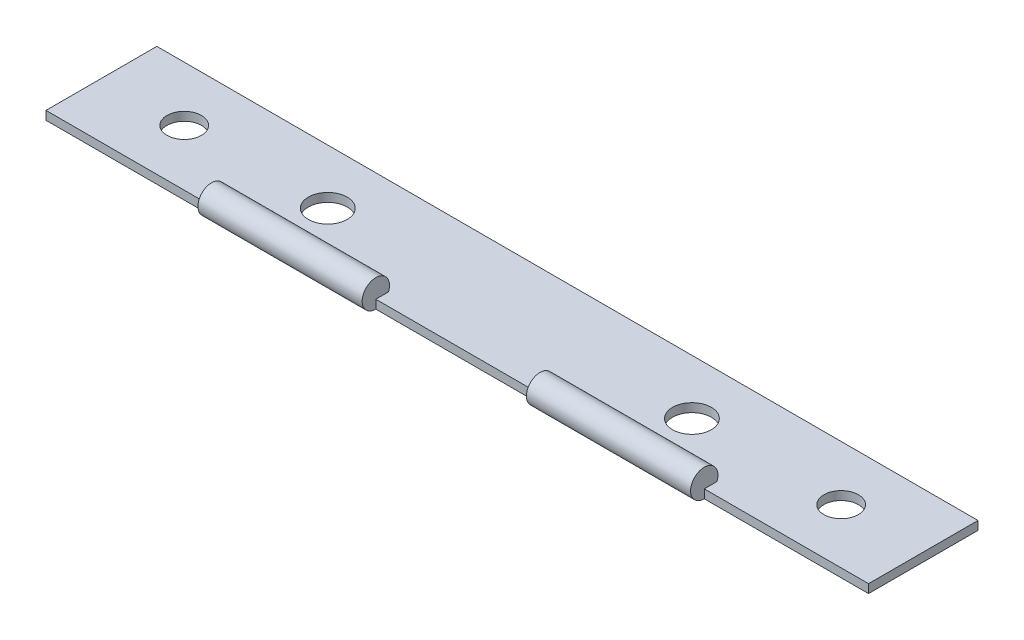
ISO-10303-21;
HEADER;
FILE_DESCRIPTION(('STEP AP214'),'2;1');
FILE_NAME('part.step','',(''),(''),'','','');
FILE_SCHEMA(('AUTOMOTIVE_DESIGN { 1 0 10303 214 1 1 1 1 }'));
ENDSEC;
DATA;
#1=APPLICATION_CONTEXT('core data for automotive mechanical design processes');
#2=APPLICATION_PROTOCOL_DEFINITION('international standard','automotive_design',2000,#1);
#3=PRODUCT_CONTEXT('',#1,'mechanical');
#4=PRODUCT('Part','Part','',(#3));
#5=PRODUCT_RELATED_PRODUCT_CATEGORY('part','',(#4));
#6=PRODUCT_DEFINITION_FORMATION('','',#4);
#7=PRODUCT_DEFINITION_CONTEXT('part definition',#1,'design');
#8=PRODUCT_DEFINITION('design','',#6,#7);
#9=PRODUCT_DEFINITION_SHAPE('','',#8);
#10=(LENGTH_UNIT() NAMED_UNIT(*) SI_UNIT(.MILLI.,.METRE.));
#11=(NAMED_UNIT(*) PLANE_ANGLE_UNIT() SI_UNIT($,.RADIAN.));
#12=(NAMED_UNIT(*) SI_UNIT($,.STERADIAN.) SOLID_ANGLE_UNIT());
#13=UNCERTAINTY_MEASURE_WITH_UNIT(LENGTH_MEASURE(1.E-05),#10,'distance_accuracy_value','');
#14=(GEOMETRIC_REPRESENTATION_CONTEXT(3) GLOBAL_UNCERTAINTY_ASSIGNED_CONTEXT((#13)) GLOBAL_UNIT_ASSIGNED_CONTEXT((#10,
#11,#12)) REPRESENTATION_CONTEXT('',''));
#15=CARTESIAN_POINT('',(0.,0.,0.));
#16=DIRECTION('',(0.,0.,1.));
#17=DIRECTION('',(1.,0.,0.));
#18=AXIS2_PLACEMENT_3D('',#15,#16,#17);
#19=CARTESIAN_POINT('',(0.,1.,0.));
#20=DIRECTION('',(1.,0.,0.));
#21=DIRECTION('',(0.,0.,-1.));
#22=AXIS2_PLACEMENT_3D('',#19,#20,#21);
#23=PLANE('',#22);
#24=DIRECTION('',(0.,0.,-1.));
#25=VECTOR('',#24,1.);
#26=CARTESIAN_POINT('',(0.,1.,-12.7));
#27=LINE('',#26,#25);
#28=CARTESIAN_POINT('',(0.,1.,0.158652849805208));
#29=VERTEX_POINT('',#28);
#30=CARTESIAN_POINT('',(0.,1.,-1.47478812037526));
#31=VERTEX_POINT('',#30);
#32=EDGE_CURVE('E141',#29,#31,#27,.T.);
#33=ORIENTED_EDGE('',*,*,#32,.F.);
#34=DIRECTION('',(0.,1.,0.));
#35=VECTOR('',#34,1.);
#36=CARTESIAN_POINT('',(0.,0.,0.158652849805208));
#37=LINE('',#36,#35);
#38=CARTESIAN_POINT('',(0.,0.00412711096169409,0.158450945450297));
#39=VERTEX_POINT('',#38);
#40=EDGE_CURVE('E50',#39,#29,#37,.T.);
#41=ORIENTED_EDGE('',*,*,#40,.F.);
#42=CARTESIAN_POINT('',(0.,0.,0.));
#43=CARTESIAN_POINT('',(0.,0.,0.522526401125121));
#44=CARTESIAN_POINT('',(0.,0.310801617957189,0.94350277757369));
#45=CARTESIAN_POINT('',(0.,0.62095901229367,1.36360656227949));
#46=CARTESIAN_POINT('',(0.,1.12150865044318,1.51756657585037));
#47=CARTESIAN_POINT('',(0.,1.62062457565087,1.67108560525673));
#48=CARTESIAN_POINT('',(0.,2.11467976531822,1.49741034624415));
#49=CARTESIAN_POINT('',(0.,2.60731984394509,1.32423254132502));
#50=CARTESIAN_POINT('',(0.,2.90142779481979,0.890926484060273));
#51=CARTESIAN_POINT('',(0.,3.1946933389816,0.458861535477884));
#52=CARTESIAN_POINT('',(0.,3.17369282021564,-0.0644095264408868));
#53=CARTESIAN_POINT('',(0.,3.15275245275785,-0.586181794961014));
#54=CARTESIAN_POINT('',(0.,2.82486645044287,-0.99452527233772));
#55=CARTESIAN_POINT('',(0.,2.49791960454525,-1.40169914078157));
#56=CARTESIAN_POINT('',(0.,1.99153552028762,-1.53522361509518));
#57=CARTESIAN_POINT('',(0.,1.48619958769518,-1.66847171046157));
#58=CARTESIAN_POINT('',(0.,1.,-1.47478812037526));
#59=B_SPLINE_CURVE_WITH_KNOTS('',2,(#42,#43,#44,#45,#46,#47,#48,#49,#50,#51,#52,#53,#54,#55,#56,
#57,#58),.UNSPECIFIED.,.F.,.F.,(3,2,2,2,2,2,2,2,3),(0.,0.125,0.25,0.375,0.5,0.625,0.75,0.875,
1.),.UNSPECIFIED.);
#60=EDGE_CURVE('E184',#39,#31,#59,.T.);
#61=ORIENTED_EDGE('',*,*,#60,.T.);
#62=EDGE_LOOP('',(#33,#41,#61));
#63=FACE_BOUND('',#62,.T.);
#64=ADVANCED_FACE('F33',(#63),#23,.F.);
#65=CARTESIAN_POINT('',(0.,1.,0.));
#66=DIRECTION('',(0.,0.,-1.));
#67=DIRECTION('',(-1.,0.,0.));
#68=AXIS2_PLACEMENT_3D('',#65,#66,#67);
#69=PLANE('',#68);
#70=DIRECTION('',(0.,1.,0.));
#71=VECTOR('',#70,1.);
#72=CARTESIAN_POINT('',(57.15,1.,0.));
#73=LINE('',#72,#71);
#74=CARTESIAN_POINT('',(57.15,0.,0.));
#75=VERTEX_POINT('',#74);
#76=CARTESIAN_POINT('',(57.15,1.,0.));
#77=VERTEX_POINT('',#76);
#78=EDGE_CURVE('E171',#75,#77,#73,.T.);
#79=ORIENTED_EDGE('',*,*,#78,.F.);
#80=DIRECTION('',(1.,0.,0.));
#81=VECTOR('',#80,1.);
#82=CARTESIAN_POINT('',(0.,0.,0.));
#83=LINE('',#82,#81);
#84=CARTESIAN_POINT('',(76.2,0.,0.));
#85=VERTEX_POINT('',#84);
#86=EDGE_CURVE('E198',#75,#85,#83,.T.);
#87=ORIENTED_EDGE('',*,*,#86,.T.);
#88=DIRECTION('',(0.,-1.,0.));
#89=VECTOR('',#88,1.);
#90=CARTESIAN_POINT('',(76.2,1.,0.));
#91=LINE('',#90,#89);
#92=CARTESIAN_POINT('',(76.2,1.,0.));
#93=VERTEX_POINT('',#92);
#94=EDGE_CURVE('E181',#93,#85,#91,.T.);
#95=ORIENTED_EDGE('',*,*,#94,.F.);
#96=DIRECTION('',(1.,0.,0.));
#97=VECTOR('',#96,1.);
#98=CARTESIAN_POINT('',(0.,1.,0.));
#99=LINE('',#98,#97);
#100=EDGE_CURVE('E124',#77,#93,#99,.T.);
#101=ORIENTED_EDGE('',*,*,#100,.F.);
#102=EDGE_LOOP('',(#79,#87,#95,#101));
#103=FACE_BOUND('',#102,.T.);
#104=ADVANCED_FACE('F245',(#103),#69,.F.);
#105=CARTESIAN_POINT('',(0.,1.,0.));
#106=DIRECTION('',(0.,-1.,0.));
#107=DIRECTION('',(0.,0.,-1.));
#108=AXIS2_PLACEMENT_3D('',#105,#106,#107);
#109=PLANE('',#108);
#110=CARTESIAN_POINT('',(7.12683113823961,1.,-6.34999999999997));
#111=DIRECTION('',(0.,1.,0.));
#112=DIRECTION('',(0.,0.,1.));
#113=AXIS2_PLACEMENT_3D('',#110,#111,#112);
#114=CIRCLE('',#113,2.24999999999999);
#115=CARTESIAN_POINT('',(7.12683113823961,1.,-4.09999999999998));
#116=VERTEX_POINT('',#115);
#117=EDGE_CURVE('E420',#116,#116,#114,.T.);
#118=ORIENTED_EDGE('',*,*,#117,.F.);
#119=EDGE_LOOP('',(#118));
#120=FACE_BOUND('',#119,.T.);
#121=CARTESIAN_POINT('',(49.3672841895202,1.,-6.34999999999997));
#122=DIRECTION('',(0.,1.,0.));
#123=DIRECTION('',(0.,0.,1.));
#124=AXIS2_PLACEMENT_3D('',#121,#122,#123);
#125=CIRCLE('',#124,2.24999999999999);
#126=CARTESIAN_POINT('',(49.3672841895202,1.,-4.09999999999998));
#127=VERTEX_POINT('',#126);
#128=EDGE_CURVE('E422',#127,#127,#125,.T.);
#129=ORIENTED_EDGE('',*,*,#128,.F.);
#130=EDGE_LOOP('',(#129));
#131=FACE_BOUND('',#130,.T.);
#132=CARTESIAN_POINT('',(-9.525,1.,-6.35));
#133=DIRECTION('',(0.,-1.,0.));
#134=DIRECTION('',(0.,0.,1.));
#135=AXIS2_PLACEMENT_3D('',#132,#133,#134);
#136=CIRCLE('',#135,2.);
#137=CARTESIAN_POINT('',(-9.525,1.,-4.35000000000001));
#138=VERTEX_POINT('',#137);
#139=EDGE_CURVE('E426',#138,#138,#136,.T.);
#140=ORIENTED_EDGE('',*,*,#139,.T.);
#141=EDGE_LOOP('',(#140));
#142=FACE_BOUND('',#141,.T.);
#143=CARTESIAN_POINT('',(66.675,1.,-6.35));
#144=DIRECTION('',(0.,1.,0.));
#145=DIRECTION('',(0.,0.,1.));
#146=AXIS2_PLACEMENT_3D('',#143,#144,#145);
#147=CIRCLE('',#146,2.);
#148=CARTESIAN_POINT('',(66.675,1.,-4.35000000000001));
#149=VERTEX_POINT('',#148);
#150=EDGE_CURVE('E146',#149,#149,#147,.T.);
#151=ORIENTED_EDGE('',*,*,#150,.F.);
#152=EDGE_LOOP('',(#151));
#153=FACE_BOUND('',#152,.T.);
#154=DIRECTION('',(0.,0.,-1.));
#155=VECTOR('',#154,1.);
#156=CARTESIAN_POINT('',(57.15,1.,0.));
#157=LINE('',#156,#155);
#158=CARTESIAN_POINT('',(57.15,1.,-1.47478812037526));
#159=VERTEX_POINT('',#158);
#160=EDGE_CURVE('E169',#77,#159,#157,.T.);
#161=ORIENTED_EDGE('',*,*,#160,.F.);
#162=ORIENTED_EDGE('',*,*,#100,.T.);
#163=DIRECTION('',(0.,0.,-1.));
#164=VECTOR('',#163,1.);
#165=CARTESIAN_POINT('',(76.2,1.,0.));
#166=LINE('',#165,#164);
#167=CARTESIAN_POINT('',(76.2,1.,-12.7));
#168=VERTEX_POINT('',#167);
#169=EDGE_CURVE('E176',#93,#168,#166,.T.);
#170=ORIENTED_EDGE('',*,*,#169,.T.);
#171=DIRECTION('',(-1.,0.,0.));
#172=VECTOR('',#171,1.);
#173=CARTESIAN_POINT('',(0.,1.,-12.7));
#174=LINE('',#173,#172);
#175=CARTESIAN_POINT('',(-19.05,1.,-12.7));
#176=VERTEX_POINT('',#175);
#177=EDGE_CURVE('E11',#168,#176,#174,.T.);
#178=ORIENTED_EDGE('',*,*,#177,.T.);
#179=DIRECTION('',(0.,0.,-1.));
#180=VECTOR('',#179,1.);
#181=CARTESIAN_POINT('',(-19.05,1.,-12.7));
#182=LINE('',#181,#180);
#183=CARTESIAN_POINT('',(-19.05,1.,0.158652849805208));
#184=VERTEX_POINT('',#183);
#185=EDGE_CURVE('E140',#184,#176,#182,.T.);
#186=ORIENTED_EDGE('',*,*,#185,.F.);
#187=DIRECTION('',(1.,0.,0.));
#188=VECTOR('',#187,1.);
#189=CARTESIAN_POINT('',(-19.05,1.,0.158652849805208));
#190=LINE('',#189,#188);
#191=EDGE_CURVE('E151',#184,#29,#190,.T.);
#192=ORIENTED_EDGE('',*,*,#191,.T.);
#193=ORIENTED_EDGE('',*,*,#32,.T.);
#194=DIRECTION('',(-1.,0.,0.));
#195=VECTOR('',#194,1.);
#196=CARTESIAN_POINT('',(19.05,1.,-1.47478812037526));
#197=LINE('',#196,#195);
#198=CARTESIAN_POINT('',(19.05,1.,-1.47478812037526));
#199=VERTEX_POINT('',#198);
#200=EDGE_CURVE('E195',#31,#199,#197,.F.);
#201=ORIENTED_EDGE('',*,*,#200,.T.);
#202=DIRECTION('',(0.,0.,-1.));
#203=VECTOR('',#202,1.);
#204=CARTESIAN_POINT('',(19.05,1.,0.));
#205=LINE('',#204,#203);
#206=CARTESIAN_POINT('',(19.05,1.,0.));
#207=VERTEX_POINT('',#206);
#208=EDGE_CURVE('E188',#207,#199,#205,.T.);
#209=ORIENTED_EDGE('',*,*,#208,.F.);
#210=CARTESIAN_POINT('',(38.1,1.,0.));
#211=VERTEX_POINT('',#210);
#212=EDGE_CURVE('E42',#207,#211,#99,.T.);
#213=ORIENTED_EDGE('',*,*,#212,.T.);
#214=DIRECTION('',(0.,0.,-1.));
#215=VECTOR('',#214,1.);
#216=CARTESIAN_POINT('',(38.1,1.,0.));
#217=LINE('',#216,#215);
#218=CARTESIAN_POINT('',(38.1,1.,-1.47478812037526));
#219=VERTEX_POINT('',#218);
#220=EDGE_CURVE('E162',#211,#219,#217,.T.);
#221=ORIENTED_EDGE('',*,*,#220,.T.);
#222=DIRECTION('',(-1.,0.,0.));
#223=VECTOR('',#222,1.);
#224=CARTESIAN_POINT('',(57.15,1.,-1.47478812037526));
#225=LINE('',#224,#223);
#226=EDGE_CURVE('E58',#219,#159,#225,.F.);
#227=ORIENTED_EDGE('',*,*,#226,.T.);
#228=EDGE_LOOP('',(#161,#162,#170,#178,#186,#192,#193,#201,#209,#213,#221,#227));
#229=FACE_BOUND('',#228,.T.);
#230=ADVANCED_FACE('F240',(#120,#131,#142,#153,#229),#109,.F.);
#231=CARTESIAN_POINT('',(19.05,0.,0.));
#232=VERTEX_POINT('',#231);
#233=CARTESIAN_POINT('',(38.1,0.,0.));
#234=VERTEX_POINT('',#233);
#235=EDGE_CURVE('E202',#232,#234,#83,.T.);
#236=ORIENTED_EDGE('',*,*,#235,.T.);
#237=DIRECTION('',(0.,1.,0.));
#238=VECTOR('',#237,1.);
#239=CARTESIAN_POINT('',(38.1,1.,0.));
#240=LINE('',#239,#238);
#241=EDGE_CURVE('E167',#234,#211,#240,.T.);
#242=ORIENTED_EDGE('',*,*,#241,.T.);
#243=ORIENTED_EDGE('',*,*,#212,.F.);
#244=DIRECTION('',(0.,1.,0.));
#245=VECTOR('',#244,1.);
#246=CARTESIAN_POINT('',(19.05,1.,0.));
#247=LINE('',#246,#245);
#248=EDGE_CURVE('E192',#232,#207,#247,.T.);
#249=ORIENTED_EDGE('',*,*,#248,.F.);
#250=EDGE_LOOP('',(#236,#242,#243,#249));
#251=FACE_BOUND('',#250,.T.);
#252=ADVANCED_FACE('F242',(#251),#69,.F.);
#253=CARTESIAN_POINT('',(0.,1.,-12.7));
#254=DIRECTION('',(0.,0.,1.));
#255=DIRECTION('',(1.,0.,0.));
#256=AXIS2_PLACEMENT_3D('',#253,#254,#255);
#257=PLANE('',#256);
#258=DIRECTION('',(-1.,0.,0.));
#259=VECTOR('',#258,1.);
#260=CARTESIAN_POINT('',(0.,0.,-12.7));
#261=LINE('',#260,#259);
#262=CARTESIAN_POINT('',(76.2,0.,-12.7));
#263=VERTEX_POINT('',#262);
#264=CARTESIAN_POINT('',(-19.05,0.,-12.7));
#265=VERTEX_POINT('',#264);
#266=EDGE_CURVE('E114',#263,#265,#261,.T.);
#267=ORIENTED_EDGE('',*,*,#266,.T.);
#268=DIRECTION('',(0.,-1.,0.));
#269=VECTOR('',#268,1.);
#270=CARTESIAN_POINT('',(-19.05,0.,-12.7));
#271=LINE('',#270,#269);
#272=EDGE_CURVE('E118',#176,#265,#271,.T.);
#273=ORIENTED_EDGE('',*,*,#272,.F.);
#274=ORIENTED_EDGE('',*,*,#177,.F.);
#275=DIRECTION('',(0.,-1.,0.));
#276=VECTOR('',#275,1.);
#277=CARTESIAN_POINT('',(76.2,1.,-12.7));
#278=LINE('',#277,#276);
#279=EDGE_CURVE('E120',#168,#263,#278,.T.);
#280=ORIENTED_EDGE('',*,*,#279,.T.);
#281=EDGE_LOOP('',(#267,#273,#274,#280));
#282=FACE_BOUND('',#281,.T.);
#283=ADVANCED_FACE('F116',(#282),#257,.F.);
#284=CARTESIAN_POINT('',(0.,0.,0.));
#285=DIRECTION('',(0.,-1.,0.));
#286=DIRECTION('',(0.,0.,-1.));
#287=AXIS2_PLACEMENT_3D('',#284,#285,#286);
#288=PLANE('',#287);
#289=CARTESIAN_POINT('',(7.12683113823961,0.,-6.34999999999997));
#290=DIRECTION('',(0.,-1.,0.));
#291=DIRECTION('',(0.,0.,-1.));
#292=AXIS2_PLACEMENT_3D('',#289,#290,#291);
#293=CIRCLE('',#292,2.24999999999999);
#294=CARTESIAN_POINT('',(7.12683113823961,0.,-8.59999999999996));
#295=VERTEX_POINT('',#294);
#296=EDGE_CURVE('E417',#295,#295,#293,.T.);
#297=ORIENTED_EDGE('',*,*,#296,.F.);
#298=EDGE_LOOP('',(#297));
#299=FACE_BOUND('',#298,.T.);
#300=CARTESIAN_POINT('',(49.3672841895202,0.,-6.34999999999997));
#301=DIRECTION('',(0.,-1.,0.));
#302=DIRECTION('',(0.,0.,-1.));
#303=AXIS2_PLACEMENT_3D('',#300,#301,#302);
#304=CIRCLE('',#303,2.24999999999999);
#305=CARTESIAN_POINT('',(49.3672841895202,0.,-8.59999999999996));
#306=VERTEX_POINT('',#305);
#307=EDGE_CURVE('E37',#306,#306,#304,.T.);
#308=ORIENTED_EDGE('',*,*,#307,.F.);
#309=EDGE_LOOP('',(#308));
#310=FACE_BOUND('',#309,.T.);
#311=CARTESIAN_POINT('',(-9.525,0.,-6.35));
#312=DIRECTION('',(0.,-1.,0.));
#313=DIRECTION('',(0.,0.,-1.));
#314=AXIS2_PLACEMENT_3D('',#311,#312,#313);
#315=CIRCLE('',#314,2.);
#316=CARTESIAN_POINT('',(-9.525,0.,-4.35000000000001));
#317=VERTEX_POINT('',#316);
#318=EDGE_CURVE('E428',#317,#317,#315,.F.);
#319=ORIENTED_EDGE('',*,*,#318,.T.);
#320=EDGE_LOOP('',(#319));
#321=FACE_BOUND('',#320,.T.);
#322=CARTESIAN_POINT('',(66.675,0.,-6.35));
#323=DIRECTION('',(0.,-1.,0.));
#324=DIRECTION('',(0.,0.,-1.));
#325=AXIS2_PLACEMENT_3D('',#322,#323,#324);
#326=CIRCLE('',#325,2.);
#327=CARTESIAN_POINT('',(66.675,0.,-4.35000000000001));
#328=VERTEX_POINT('',#327);
#329=EDGE_CURVE('E228',#328,#328,#326,.T.);
#330=ORIENTED_EDGE('',*,*,#329,.F.);
#331=EDGE_LOOP('',(#330));
#332=FACE_BOUND('',#331,.T.);
#333=CARTESIAN_POINT('',(0.,0.,0.));
#334=VERTEX_POINT('',#333);
#335=EDGE_CURVE('E125',#334,#232,#83,.T.);
#336=ORIENTED_EDGE('',*,*,#335,.F.);
#337=CARTESIAN_POINT('',(0.,0.,0.));
#338=DIRECTION('',(0.,0.,1.));
#339=VECTOR('',#338,1.);
#340=LINE('',#337,#339);
#341=EDGE_CURVE('E189',#334,#39,#340,.T.);
#342=ORIENTED_EDGE('',*,*,#341,.T.);
#343=DIRECTION('',(1.,0.,0.));
#344=VECTOR('',#343,1.);
#345=CARTESIAN_POINT('',(-19.05,0.,0.158652849805208));
#346=LINE('',#345,#344);
#347=CARTESIAN_POINT('',(-19.05,0.,0.158652849805208));
#348=VERTEX_POINT('',#347);
#349=EDGE_CURVE('E132',#348,#39,#346,.T.);
#350=ORIENTED_EDGE('',*,*,#349,.F.);
#351=DIRECTION('',(0.,0.,1.));
#352=VECTOR('',#351,1.);
#353=CARTESIAN_POINT('',(-19.05,0.,-12.7));
#354=LINE('',#353,#352);
#355=EDGE_CURVE('E128',#265,#348,#354,.T.);
#356=ORIENTED_EDGE('',*,*,#355,.F.);
#357=ORIENTED_EDGE('',*,*,#266,.F.);
#358=DIRECTION('',(0.,0.,-1.));
#359=VECTOR('',#358,1.);
#360=CARTESIAN_POINT('',(76.2,0.,0.));
#361=LINE('',#360,#359);
#362=EDGE_CURVE('E175',#85,#263,#361,.T.);
#363=ORIENTED_EDGE('',*,*,#362,.F.);
#364=ORIENTED_EDGE('',*,*,#86,.F.);
#365=EDGE_CURVE('E201',#234,#75,#83,.T.);
#366=ORIENTED_EDGE('',*,*,#365,.F.);
#367=ORIENTED_EDGE('',*,*,#235,.F.);
#368=EDGE_LOOP('',(#336,#342,#350,#356,#357,#363,#364,#366,#367));
#369=FACE_BOUND('',#368,.T.);
#370=ADVANCED_FACE('F129',(#299,#310,#321,#332,#369),#288,.T.);
#371=CARTESIAN_POINT('',(19.05,1.5875,0.));
#372=DIRECTION('',(-1.,0.,0.));
#373=DIRECTION('',(0.,0.,1.));
#374=AXIS2_PLACEMENT_3D('',#371,#372,#373);
#375=CYLINDRICAL_SURFACE('',#374,1.5875);
#376=ORIENTED_EDGE('',*,*,#200,.F.);
#377=ORIENTED_EDGE('',*,*,#60,.F.);
#378=ORIENTED_EDGE('',*,*,#341,.F.);
#379=ORIENTED_EDGE('',*,*,#335,.T.);
#380=CARTESIAN_POINT('',(19.05,1.5875,0.));
#381=DIRECTION('',(-1.,0.,0.));
#382=DIRECTION('',(0.,0.,1.));
#383=AXIS2_PLACEMENT_3D('',#380,#381,#382);
#384=CIRCLE('',#383,1.5875);
#385=EDGE_CURVE('E185',#232,#199,#384,.T.);
#386=ORIENTED_EDGE('',*,*,#385,.T.);
#387=EDGE_LOOP('',(#376,#377,#378,#379,#386));
#388=FACE_BOUND('',#387,.T.);
#389=ADVANCED_FACE('F238',(#388),#375,.T.);
#390=CARTESIAN_POINT('',(19.05,1.5875,0.));
#391=DIRECTION('',(-1.,0.,0.));
#392=DIRECTION('',(0.,0.,1.));
#393=AXIS2_PLACEMENT_3D('',#390,#391,#392);
#394=PLANE('',#393);
#395=ORIENTED_EDGE('',*,*,#385,.F.);
#396=ORIENTED_EDGE('',*,*,#248,.T.);
#397=ORIENTED_EDGE('',*,*,#208,.T.);
#398=EDGE_LOOP('',(#395,#396,#397));
#399=FACE_BOUND('',#398,.T.);
#400=ADVANCED_FACE('F291',(#399),#394,.F.);
#401=CARTESIAN_POINT('',(76.2,1.,0.));
#402=DIRECTION('',(-1.,0.,0.));
#403=DIRECTION('',(0.,0.,1.));
#404=AXIS2_PLACEMENT_3D('',#401,#402,#403);
#405=PLANE('',#404);
#406=ORIENTED_EDGE('',*,*,#362,.T.);
#407=ORIENTED_EDGE('',*,*,#279,.F.);
#408=ORIENTED_EDGE('',*,*,#169,.F.);
#409=ORIENTED_EDGE('',*,*,#94,.T.);
#410=EDGE_LOOP('',(#406,#407,#408,#409));
#411=FACE_BOUND('',#410,.T.);
#412=ADVANCED_FACE('F267',(#411),#405,.F.);
#413=CARTESIAN_POINT('',(57.15,1.5875,0.));
#414=DIRECTION('',(-1.,0.,0.));
#415=DIRECTION('',(0.,0.,1.));
#416=AXIS2_PLACEMENT_3D('',#413,#414,#415);
#417=CYLINDRICAL_SURFACE('',#416,1.5875);
#418=ORIENTED_EDGE('',*,*,#226,.F.);
#419=CARTESIAN_POINT('',(38.1,1.5875,0.));
#420=DIRECTION('',(-1.,0.,0.));
#421=DIRECTION('',(0.,0.,1.));
#422=AXIS2_PLACEMENT_3D('',#419,#420,#421);
#423=CIRCLE('',#422,1.5875);
#424=EDGE_CURVE('E163',#234,#219,#423,.T.);
#425=ORIENTED_EDGE('',*,*,#424,.F.);
#426=ORIENTED_EDGE('',*,*,#365,.T.);
#427=CARTESIAN_POINT('',(57.15,1.5875,0.));
#428=DIRECTION('',(-1.,0.,0.));
#429=DIRECTION('',(0.,0.,1.));
#430=AXIS2_PLACEMENT_3D('',#427,#428,#429);
#431=CIRCLE('',#430,1.5875);
#432=EDGE_CURVE('E159',#75,#159,#431,.T.);
#433=ORIENTED_EDGE('',*,*,#432,.T.);
#434=EDGE_LOOP('',(#418,#425,#426,#433));
#435=FACE_BOUND('',#434,.T.);
#436=ADVANCED_FACE('F274',(#435),#417,.T.);
#437=CARTESIAN_POINT('',(57.15,1.5875,0.));
#438=DIRECTION('',(-1.,0.,0.));
#439=DIRECTION('',(0.,0.,1.));
#440=AXIS2_PLACEMENT_3D('',#437,#438,#439);
#441=PLANE('',#440);
#442=ORIENTED_EDGE('',*,*,#432,.F.);
#443=ORIENTED_EDGE('',*,*,#78,.T.);
#444=ORIENTED_EDGE('',*,*,#160,.T.);
#445=EDGE_LOOP('',(#442,#443,#444));
#446=FACE_BOUND('',#445,.T.);
#447=ADVANCED_FACE('F275',(#446),#441,.F.);
#448=CARTESIAN_POINT('',(38.1,1.5875,0.));
#449=DIRECTION('',(-1.,0.,0.));
#450=DIRECTION('',(0.,0.,1.));
#451=AXIS2_PLACEMENT_3D('',#448,#449,#450);
#452=PLANE('',#451);
#453=ORIENTED_EDGE('',*,*,#241,.F.);
#454=ORIENTED_EDGE('',*,*,#424,.T.);
#455=ORIENTED_EDGE('',*,*,#220,.F.);
#456=EDGE_LOOP('',(#453,#454,#455));
#457=FACE_BOUND('',#456,.T.);
#458=ADVANCED_FACE('F277',(#457),#452,.T.);
#459=CARTESIAN_POINT('',(-19.05,0.,0.158652849805208));
#460=DIRECTION('',(0.,0.,-1.));
#461=DIRECTION('',(-1.,0.,0.));
#462=AXIS2_PLACEMENT_3D('',#459,#460,#461);
#463=PLANE('',#462);
#464=ORIENTED_EDGE('',*,*,#40,.T.);
#465=ORIENTED_EDGE('',*,*,#191,.F.);
#466=DIRECTION('',(0.,1.,0.));
#467=VECTOR('',#466,1.);
#468=CARTESIAN_POINT('',(-19.05,0.,0.158652849805208));
#469=LINE('',#468,#467);
#470=EDGE_CURVE('E135',#348,#184,#469,.T.);
#471=ORIENTED_EDGE('',*,*,#470,.F.);
#472=ORIENTED_EDGE('',*,*,#349,.T.);
#473=EDGE_LOOP('',(#464,#465,#471,#472));
#474=FACE_BOUND('',#473,.T.);
#475=ADVANCED_FACE('F260',(#474),#463,.F.);
#476=CARTESIAN_POINT('',(-19.05,0.,0.));
#477=DIRECTION('',(1.,0.,0.));
#478=DIRECTION('',(0.,0.,-1.));
#479=AXIS2_PLACEMENT_3D('',#476,#477,#478);
#480=PLANE('',#479);
#481=ORIENTED_EDGE('',*,*,#272,.T.);
#482=ORIENTED_EDGE('',*,*,#355,.T.);
#483=ORIENTED_EDGE('',*,*,#470,.T.);
#484=ORIENTED_EDGE('',*,*,#185,.T.);
#485=EDGE_LOOP('',(#481,#482,#483,#484));
#486=FACE_BOUND('',#485,.T.);
#487=ADVANCED_FACE('F138',(#486),#480,.F.);
#488=CARTESIAN_POINT('',(66.675,-18.05,-6.35));
#489=DIRECTION('',(0.,1.,0.));
#490=DIRECTION('',(0.,0.,1.));
#491=AXIS2_PLACEMENT_3D('',#488,#489,#490);
#492=CYLINDRICAL_SURFACE('',#491,2.);
#493=CARTESIAN_POINT('',(66.675,0.,-4.35000000000001));
#494=CARTESIAN_POINT('',(66.675,0.0104166666666667,-4.35000000000001));
#495=CARTESIAN_POINT('',(66.675,0.0208333333333333,-4.35000000000001));
#496=CARTESIAN_POINT('',(66.675,0.0416666666666667,-4.35000000000001));
#497=CARTESIAN_POINT('',(66.675,0.0520833333333334,-4.35000000000001));
#498=CARTESIAN_POINT('',(66.675,0.0729166666666667,-4.35000000000001));
#499=CARTESIAN_POINT('',(66.675,0.0833333333333334,-4.35000000000001));
#500=CARTESIAN_POINT('',(66.675,0.104166666666667,-4.35000000000001));
#501=CARTESIAN_POINT('',(66.675,0.114583333333333,-4.35000000000001));
#502=CARTESIAN_POINT('',(66.675,0.135416666666667,-4.35000000000001));
#503=CARTESIAN_POINT('',(66.675,0.145833333333333,-4.35000000000001));
#504=CARTESIAN_POINT('',(66.675,0.166666666666667,-4.35000000000001));
#505=CARTESIAN_POINT('',(66.675,0.177083333333333,-4.35000000000001));
#506=CARTESIAN_POINT('',(66.675,0.197916666666667,-4.35000000000001));
#507=CARTESIAN_POINT('',(66.675,0.208333333333334,-4.35000000000001));
#508=CARTESIAN_POINT('',(66.675,0.229166666666667,-4.35000000000001));
#509=CARTESIAN_POINT('',(66.675,0.239583333333334,-4.35000000000001));
#510=CARTESIAN_POINT('',(66.675,0.260416666666667,-4.35000000000001));
#511=CARTESIAN_POINT('',(66.675,0.270833333333334,-4.35000000000001));
#512=CARTESIAN_POINT('',(66.675,0.291666666666667,-4.35000000000001));
#513=CARTESIAN_POINT('',(66.675,0.302083333333334,-4.35000000000001));
#514=CARTESIAN_POINT('',(66.675,0.322916666666667,-4.35000000000001));
#515=CARTESIAN_POINT('',(66.675,0.333333333333334,-4.35000000000001));
#516=CARTESIAN_POINT('',(66.675,0.354166666666667,-4.35000000000001));
#517=CARTESIAN_POINT('',(66.675,0.364583333333334,-4.35000000000001));
#518=CARTESIAN_POINT('',(66.675,0.385416666666667,-4.35000000000001));
#519=CARTESIAN_POINT('',(66.675,0.395833333333334,-4.35000000000001));
#520=CARTESIAN_POINT('',(66.675,0.416666666666667,-4.35000000000001));
#521=CARTESIAN_POINT('',(66.675,0.427083333333334,-4.35000000000001));
#522=CARTESIAN_POINT('',(66.675,0.447916666666667,-4.35000000000001));
#523=CARTESIAN_POINT('',(66.675,0.458333333333334,-4.35000000000001));
#524=CARTESIAN_POINT('',(66.675,0.479166666666667,-4.35000000000001));
#525=CARTESIAN_POINT('',(66.675,0.489583333333334,-4.35000000000001));
#526=CARTESIAN_POINT('',(66.675,0.510416666666667,-4.35000000000001));
#527=CARTESIAN_POINT('',(66.675,0.520833333333334,-4.35000000000001));
#528=CARTESIAN_POINT('',(66.675,0.541666666666667,-4.35000000000001));
#529=CARTESIAN_POINT('',(66.675,0.552083333333334,-4.35000000000001));
#530=CARTESIAN_POINT('',(66.675,0.572916666666667,-4.35000000000001));
#531=CARTESIAN_POINT('',(66.675,0.583333333333334,-4.35000000000001));
#532=CARTESIAN_POINT('',(66.675,0.604166666666667,-4.35000000000001));
#533=CARTESIAN_POINT('',(66.675,0.614583333333334,-4.35000000000001));
#534=CARTESIAN_POINT('',(66.675,0.635416666666667,-4.35000000000001));
#535=CARTESIAN_POINT('',(66.675,0.645833333333334,-4.35000000000001));
#536=CARTESIAN_POINT('',(66.675,0.666666666666667,-4.35000000000001));
#537=CARTESIAN_POINT('',(66.675,0.677083333333334,-4.35000000000001));
#538=CARTESIAN_POINT('',(66.675,0.697916666666667,-4.35000000000001));
#539=CARTESIAN_POINT('',(66.675,0.708333333333334,-4.35000000000001));
#540=CARTESIAN_POINT('',(66.675,0.729166666666667,-4.35000000000001));
#541=CARTESIAN_POINT('',(66.675,0.739583333333334,-4.35000000000001));
#542=CARTESIAN_POINT('',(66.675,0.760416666666667,-4.35000000000001));
#543=CARTESIAN_POINT('',(66.675,0.770833333333334,-4.35000000000001));
#544=CARTESIAN_POINT('',(66.675,0.791666666666667,-4.35000000000001));
#545=CARTESIAN_POINT('',(66.675,0.802083333333334,-4.35000000000001));
#546=CARTESIAN_POINT('',(66.675,0.822916666666667,-4.35000000000001));
#547=CARTESIAN_POINT('',(66.675,0.833333333333334,-4.35000000000001));
#548=CARTESIAN_POINT('',(66.675,0.854166666666667,-4.35000000000001));
#549=CARTESIAN_POINT('',(66.675,0.864583333333334,-4.35000000000001));
#550=CARTESIAN_POINT('',(66.675,0.885416666666668,-4.35000000000001));
#551=CARTESIAN_POINT('',(66.675,0.895833333333334,-4.35000000000001));
#552=CARTESIAN_POINT('',(66.675,0.916666666666668,-4.35000000000001));
#553=CARTESIAN_POINT('',(66.675,0.927083333333334,-4.35000000000001));
#554=CARTESIAN_POINT('',(66.675,0.947916666666668,-4.35000000000001));
#555=CARTESIAN_POINT('',(66.675,0.958333333333334,-4.35000000000001));
#556=CARTESIAN_POINT('',(66.675,0.979166666666668,-4.35000000000001));
#557=CARTESIAN_POINT('',(66.675,0.989583333333334,-4.35000000000001));
#558=CARTESIAN_POINT('',(66.675,1.,-4.35000000000001));
#559=B_SPLINE_CURVE_WITH_KNOTS('',3,(#493,#494,#495,#496,#497,#498,#499,#500,#501,#502,#503,
#504,#505,#506,#507,#508,#509,#510,#511,#512,#513,#514,#515,#516,#517,#518,#519,#520,#521,#522,
#523,#524,#525,#526,#527,#528,#529,#530,#531,#532,#533,#534,#535,#536,#537,#538,#539,#540,#541,
#542,#543,#544,#545,#546,#547,#548,#549,#550,#551,#552,#553,#554,#555,#556,#557,#558),
.UNSPECIFIED.,.F.,.F.,(4,2,2,2,2,2,2,2,2,2,2,2,2,2,2,2,2,2,2,2,2,2,2,2,2,2,2,2,2,2,2,2,4),(0.,
0.03125,0.0625000000000001,0.0937500000000001,0.125,0.15625,0.1875,0.21875,0.25,0.28125,0.3125,
0.34375,0.375,0.40625,0.4375,0.46875,0.5,0.53125,0.5625,0.593750000000001,0.625000000000001,
0.656250000000001,0.687500000000001,0.718750000000001,0.750000000000001,0.781250000000001,
0.812500000000001,0.843750000000001,0.875000000000001,0.906250000000001,0.937500000000001,
0.968750000000001,1.),.UNSPECIFIED.);
#560=EDGE_CURVE('BSEAM372',#328,#149,#559,.T.);
#561=ORIENTED_EDGE('',*,*,#329,.T.);
#562=ORIENTED_EDGE('',*,*,#150,.T.);
#563=ORIENTED_EDGE('',*,*,#560,.T.);
#564=ORIENTED_EDGE('',*,*,#560,.F.);
#565=EDGE_LOOP('',(#561,#563,#562,#564));
#566=FACE_BOUND('',#565,.T.);
#567=ADVANCED_FACE('F372',(#566),#492,.F.);
#568=CARTESIAN_POINT('',(-9.525,-18.05,-6.35));
#569=DIRECTION('',(0.,1.,0.));
#570=DIRECTION('',(0.,0.,1.));
#571=AXIS2_PLACEMENT_3D('',#568,#569,#570);
#572=CYLINDRICAL_SURFACE('',#571,2.);
#573=CARTESIAN_POINT('',(-9.525,0.,-4.35000000000001));
#574=CARTESIAN_POINT('',(-9.525,0.0104166666666667,-4.35000000000001));
#575=CARTESIAN_POINT('',(-9.525,0.0208333333333333,-4.35000000000001));
#576=CARTESIAN_POINT('',(-9.525,0.0416666666666667,-4.35000000000001));
#577=CARTESIAN_POINT('',(-9.525,0.0520833333333334,-4.35000000000001));
#578=CARTESIAN_POINT('',(-9.525,0.0729166666666667,-4.35000000000001));
#579=CARTESIAN_POINT('',(-9.525,0.0833333333333334,-4.35000000000001));
#580=CARTESIAN_POINT('',(-9.525,0.104166666666667,-4.35000000000001));
#581=CARTESIAN_POINT('',(-9.525,0.114583333333333,-4.35000000000001));
#582=CARTESIAN_POINT('',(-9.525,0.135416666666667,-4.35000000000001));
#583=CARTESIAN_POINT('',(-9.525,0.145833333333333,-4.35000000000001));
#584=CARTESIAN_POINT('',(-9.525,0.166666666666667,-4.35000000000001));
#585=CARTESIAN_POINT('',(-9.525,0.177083333333333,-4.35000000000001));
#586=CARTESIAN_POINT('',(-9.525,0.197916666666667,-4.35000000000001));
#587=CARTESIAN_POINT('',(-9.525,0.208333333333334,-4.35000000000001));
#588=CARTESIAN_POINT('',(-9.525,0.229166666666667,-4.35000000000001));
#589=CARTESIAN_POINT('',(-9.525,0.239583333333334,-4.35000000000001));
#590=CARTESIAN_POINT('',(-9.525,0.260416666666667,-4.35000000000001));
#591=CARTESIAN_POINT('',(-9.525,0.270833333333334,-4.35000000000001));
#592=CARTESIAN_POINT('',(-9.525,0.291666666666667,-4.35000000000001));
#593=CARTESIAN_POINT('',(-9.525,0.302083333333334,-4.35000000000001));
#594=CARTESIAN_POINT('',(-9.525,0.322916666666667,-4.35000000000001));
#595=CARTESIAN_POINT('',(-9.525,0.333333333333334,-4.35000000000001));
#596=CARTESIAN_POINT('',(-9.525,0.354166666666667,-4.35000000000001));
#597=CARTESIAN_POINT('',(-9.525,0.364583333333334,-4.35000000000001));
#598=CARTESIAN_POINT('',(-9.525,0.385416666666667,-4.35000000000001));
#599=CARTESIAN_POINT('',(-9.525,0.395833333333334,-4.35000000000001));
#600=CARTESIAN_POINT('',(-9.525,0.416666666666667,-4.35000000000001));
#601=CARTESIAN_POINT('',(-9.525,0.427083333333334,-4.35000000000001));
#602=CARTESIAN_POINT('',(-9.525,0.447916666666667,-4.35000000000001));
#603=CARTESIAN_POINT('',(-9.525,0.458333333333334,-4.35000000000001));
#604=CARTESIAN_POINT('',(-9.525,0.479166666666667,-4.35000000000001));
#605=CARTESIAN_POINT('',(-9.525,0.489583333333334,-4.35000000000001));
#606=CARTESIAN_POINT('',(-9.525,0.510416666666667,-4.35000000000001));
#607=CARTESIAN_POINT('',(-9.525,0.520833333333334,-4.35000000000001));
#608=CARTESIAN_POINT('',(-9.525,0.541666666666667,-4.35000000000001));
#609=CARTESIAN_POINT('',(-9.525,0.552083333333334,-4.35000000000001));
#610=CARTESIAN_POINT('',(-9.525,0.572916666666667,-4.35000000000001));
#611=CARTESIAN_POINT('',(-9.525,0.583333333333334,-4.35000000000001));
#612=CARTESIAN_POINT('',(-9.525,0.604166666666667,-4.35000000000001));
#613=CARTESIAN_POINT('',(-9.525,0.614583333333334,-4.35000000000001));
#614=CARTESIAN_POINT('',(-9.525,0.635416666666667,-4.35000000000001));
#615=CARTESIAN_POINT('',(-9.525,0.645833333333334,-4.35000000000001));
#616=CARTESIAN_POINT('',(-9.525,0.666666666666667,-4.35000000000001));
#617=CARTESIAN_POINT('',(-9.525,0.677083333333334,-4.35000000000001));
#618=CARTESIAN_POINT('',(-9.525,0.697916666666667,-4.35000000000001));
#619=CARTESIAN_POINT('',(-9.525,0.708333333333334,-4.35000000000001));
#620=CARTESIAN_POINT('',(-9.525,0.729166666666667,-4.35000000000001));
#621=CARTESIAN_POINT('',(-9.525,0.739583333333334,-4.35000000000001));
#622=CARTESIAN_POINT('',(-9.525,0.760416666666667,-4.35000000000001));
#623=CARTESIAN_POINT('',(-9.525,0.770833333333334,-4.35000000000001));
#624=CARTESIAN_POINT('',(-9.525,0.791666666666667,-4.35000000000001));
#625=CARTESIAN_POINT('',(-9.525,0.802083333333334,-4.35000000000001));
#626=CARTESIAN_POINT('',(-9.525,0.822916666666667,-4.35000000000001));
#627=CARTESIAN_POINT('',(-9.525,0.833333333333334,-4.35000000000001));
#628=CARTESIAN_POINT('',(-9.525,0.854166666666667,-4.35000000000001));
#629=CARTESIAN_POINT('',(-9.525,0.864583333333334,-4.35000000000001));
#630=CARTESIAN_POINT('',(-9.525,0.885416666666668,-4.35000000000001));
#631=CARTESIAN_POINT('',(-9.525,0.895833333333334,-4.35000000000001));
#632=CARTESIAN_POINT('',(-9.525,0.916666666666668,-4.35000000000001));
#633=CARTESIAN_POINT('',(-9.525,0.927083333333334,-4.35000000000001));
#634=CARTESIAN_POINT('',(-9.525,0.947916666666668,-4.35000000000001));
#635=CARTESIAN_POINT('',(-9.525,0.958333333333334,-4.35000000000001));
#636=CARTESIAN_POINT('',(-9.525,0.979166666666668,-4.35000000000001));
#637=CARTESIAN_POINT('',(-9.525,0.989583333333334,-4.35000000000001));
#638=CARTESIAN_POINT('',(-9.525,1.,-4.35000000000001));
#639=B_SPLINE_CURVE_WITH_KNOTS('',3,(#573,#574,#575,#576,#577,#578,#579,#580,#581,#582,#583,
#584,#585,#586,#587,#588,#589,#590,#591,#592,#593,#594,#595,#596,#597,#598,#599,#600,#601,#602,
#603,#604,#605,#606,#607,#608,#609,#610,#611,#612,#613,#614,#615,#616,#617,#618,#619,#620,#621,
#622,#623,#624,#625,#626,#627,#628,#629,#630,#631,#632,#633,#634,#635,#636,#637,#638),
.UNSPECIFIED.,.F.,.F.,(4,2,2,2,2,2,2,2,2,2,2,2,2,2,2,2,2,2,2,2,2,2,2,2,2,2,2,2,2,2,2,2,4),(0.,
0.03125,0.0625000000000001,0.0937500000000001,0.125,0.15625,0.1875,0.21875,0.25,0.28125,0.3125,
0.34375,0.375,0.40625,0.4375,0.46875,0.5,0.53125,0.5625,0.593750000000001,0.625000000000001,
0.656250000000001,0.687500000000001,0.718750000000001,0.750000000000001,0.781250000000001,
0.812500000000001,0.843750000000001,0.875000000000001,0.906250000000001,0.937500000000001,
0.968750000000001,1.),.UNSPECIFIED.);
#640=EDGE_CURVE('BSEAM379',#317,#138,#639,.T.);
#641=ORIENTED_EDGE('',*,*,#318,.F.);
#642=ORIENTED_EDGE('',*,*,#139,.F.);
#643=ORIENTED_EDGE('',*,*,#640,.T.);
#644=ORIENTED_EDGE('',*,*,#640,.F.);
#645=EDGE_LOOP('',(#641,#643,#642,#644));
#646=FACE_BOUND('',#645,.T.);
#647=ADVANCED_FACE('F379',(#646),#572,.F.);
#648=CARTESIAN_POINT('',(49.3672841895202,1.,-6.34999999999997));
#649=DIRECTION('',(0.,1.,0.));
#650=DIRECTION('',(0.,0.,1.));
#651=AXIS2_PLACEMENT_3D('',#648,#649,#650);
#652=CYLINDRICAL_SURFACE('',#651,2.24999999999999);
#653=ORIENTED_EDGE('',*,*,#307,.T.);
#654=EDGE_LOOP('',(#653));
#655=FACE_BOUND('',#654,.T.);
#656=ORIENTED_EDGE('',*,*,#128,.T.);
#657=EDGE_LOOP('',(#656));
#658=FACE_BOUND('',#657,.T.);
#659=ADVANCED_FACE('F388',(#655,#658),#652,.F.);
#660=CARTESIAN_POINT('',(7.12683113823961,1.,-6.34999999999997));
#661=DIRECTION('',(0.,1.,0.));
#662=DIRECTION('',(0.,0.,1.));
#663=AXIS2_PLACEMENT_3D('',#660,#661,#662);
#664=CYLINDRICAL_SURFACE('',#663,2.24999999999999);
#665=ORIENTED_EDGE('',*,*,#296,.T.);
#666=EDGE_LOOP('',(#665));
#667=FACE_BOUND('',#666,.T.);
#668=ORIENTED_EDGE('',*,*,#117,.T.);
#669=EDGE_LOOP('',(#668));
#670=FACE_BOUND('',#669,.T.);
#671=ADVANCED_FACE('F397',(#667,#670),#664,.F.);
#672=CLOSED_SHELL('',(#64,#104,#230,#252,#283,#370,#389,#400,#412,#436,#447,#458,#475,#487,#567,
#647,#659,#671));
#673=MANIFOLD_SOLID_BREP('B2',#672);
#674=ADVANCED_BREP_SHAPE_REPRESENTATION('',(#18,#673),#14);
#675=SHAPE_DEFINITION_REPRESENTATION(#9,#674);
ENDSEC;
END-ISO-10303-21;
